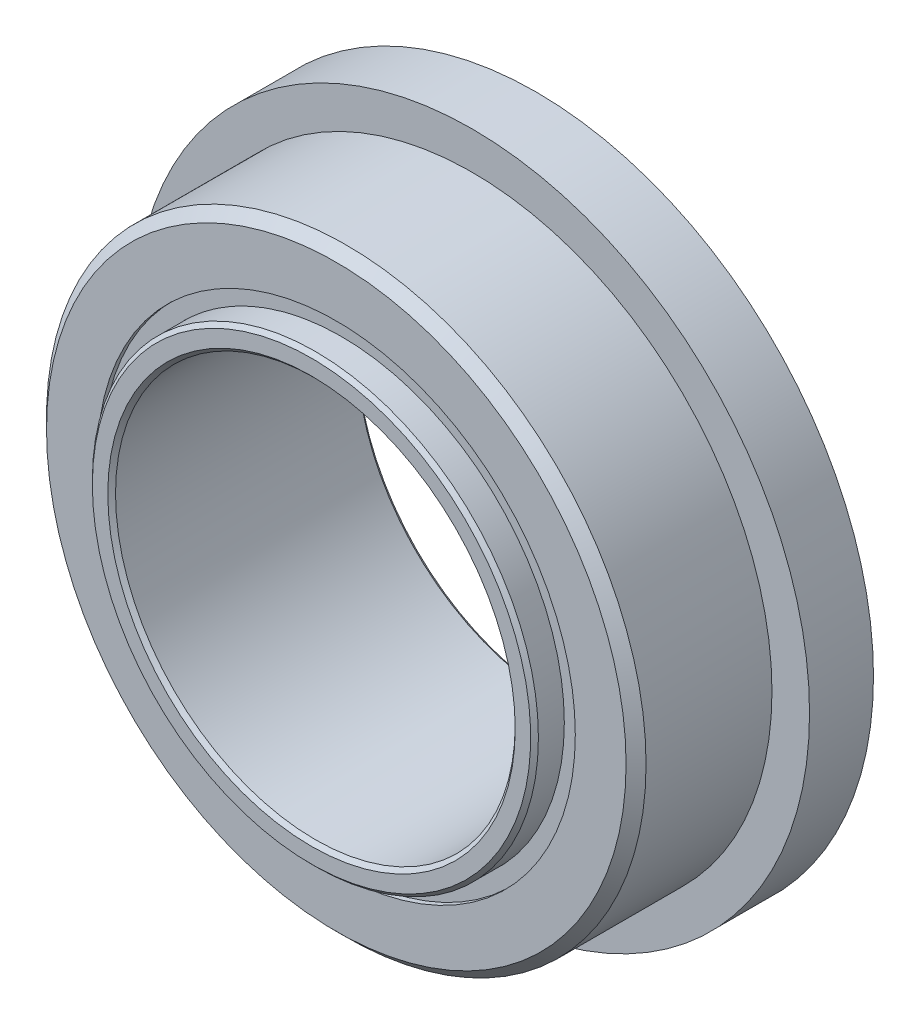
ISO-10303-21;
HEADER;
FILE_DESCRIPTION(('STEP AP214'),'2;1');
FILE_NAME('part.step','',(''),(''),'','','');
FILE_SCHEMA(('AUTOMOTIVE_DESIGN { 1 0 10303 214 1 1 1 1 }'));
ENDSEC;
DATA;
#1=APPLICATION_CONTEXT('core data for automotive mechanical design processes');
#2=APPLICATION_PROTOCOL_DEFINITION('international standard','automotive_design',2000,#1);
#3=PRODUCT_CONTEXT('',#1,'mechanical');
#4=PRODUCT('Part','Part','',(#3));
#5=PRODUCT_RELATED_PRODUCT_CATEGORY('part','',(#4));
#6=PRODUCT_DEFINITION_FORMATION('','',#4);
#7=PRODUCT_DEFINITION_CONTEXT('part definition',#1,'design');
#8=PRODUCT_DEFINITION('design','',#6,#7);
#9=PRODUCT_DEFINITION_SHAPE('','',#8);
#10=(LENGTH_UNIT() NAMED_UNIT(*) SI_UNIT(.MILLI.,.METRE.));
#11=(NAMED_UNIT(*) PLANE_ANGLE_UNIT() SI_UNIT($,.RADIAN.));
#12=(NAMED_UNIT(*) SI_UNIT($,.STERADIAN.) SOLID_ANGLE_UNIT());
#13=UNCERTAINTY_MEASURE_WITH_UNIT(LENGTH_MEASURE(1.E-05),#10,'distance_accuracy_value','');
#14=(GEOMETRIC_REPRESENTATION_CONTEXT(3) GLOBAL_UNCERTAINTY_ASSIGNED_CONTEXT((#13)) GLOBAL_UNIT_ASSIGNED_CONTEXT((#10,
#11,#12)) REPRESENTATION_CONTEXT('',''));
#15=CARTESIAN_POINT('',(0.,0.,0.));
#16=DIRECTION('',(0.,0.,1.));
#17=DIRECTION('',(1.,0.,0.));
#18=AXIS2_PLACEMENT_3D('',#15,#16,#17);
#19=CARTESIAN_POINT('',(0.,3.7973,-1.508125));
#20=DIRECTION('',(0.,0.,1.));
#21=DIRECTION('',(1.,0.,0.));
#22=AXIS2_PLACEMENT_3D('',#19,#20,#21);
#23=PLANE('',#22);
#24=CARTESIAN_POINT('',(0.,0.,-1.508125));
#25=DIRECTION('',(0.,0.,1.));
#26=DIRECTION('',(1.,0.,0.));
#27=AXIS2_PLACEMENT_3D('',#24,#25,#26);
#28=CIRCLE('',#27,3.7973);
#29=CARTESIAN_POINT('',(3.7973,0.,-1.508125));
#30=VERTEX_POINT('',#29);
#31=EDGE_CURVE('E58',#30,#30,#28,.T.);
#32=ORIENTED_EDGE('',*,*,#31,.F.);
#33=EDGE_LOOP('',(#32));
#34=FACE_BOUND('',#33,.T.);
#35=CARTESIAN_POINT('',(0.,0.,-1.508125));
#36=DIRECTION('',(0.,0.,1.));
#37=DIRECTION('',(1.,0.,0.));
#38=AXIS2_PLACEMENT_3D('',#35,#36,#37);
#39=CIRCLE('',#38,3.5433);
#40=CARTESIAN_POINT('',(3.5433,0.,-1.508125));
#41=VERTEX_POINT('',#40);
#42=EDGE_CURVE('E11',#41,#41,#39,.T.);
#43=ORIENTED_EDGE('',*,*,#42,.T.);
#44=EDGE_LOOP('',(#43));
#45=FACE_BOUND('',#44,.T.);
#46=ADVANCED_FACE('F44',(#34,#45),#23,.F.);
#47=CARTESIAN_POINT('',(0.,0.,1.5875));
#48=DIRECTION('',(0.,0.,1.));
#49=DIRECTION('',(1.,0.,0.));
#50=AXIS2_PLACEMENT_3D('',#47,#48,#49);
#51=CYLINDRICAL_SURFACE('',#50,3.5433);
#52=ORIENTED_EDGE('',*,*,#42,.F.);
#53=EDGE_LOOP('',(#52));
#54=FACE_BOUND('',#53,.T.);
#55=CARTESIAN_POINT('',(0.,0.,-0.529166666666667));
#56=DIRECTION('',(0.,0.,1.));
#57=DIRECTION('',(1.,0.,0.));
#58=AXIS2_PLACEMENT_3D('',#55,#56,#57);
#59=CIRCLE('',#58,3.5433);
#60=CARTESIAN_POINT('',(3.5433,0.,-0.529166666666667));
#61=VERTEX_POINT('',#60);
#62=EDGE_CURVE('E50',#61,#61,#59,.T.);
#63=ORIENTED_EDGE('',*,*,#62,.T.);
#64=EDGE_LOOP('',(#63));
#65=FACE_BOUND('',#64,.T.);
#66=ADVANCED_FACE('F67',(#54,#65),#51,.F.);
#67=CARTESIAN_POINT('',(0.,3.7973,-0.529166666666667));
#68=DIRECTION('',(0.,0.,-1.));
#69=DIRECTION('',(-1.,0.,0.));
#70=AXIS2_PLACEMENT_3D('',#67,#68,#69);
#71=PLANE('',#70);
#72=ORIENTED_EDGE('',*,*,#62,.F.);
#73=EDGE_LOOP('',(#72));
#74=FACE_BOUND('',#73,.T.);
#75=CARTESIAN_POINT('',(0.,0.,-0.529166666666667));
#76=DIRECTION('',(0.,0.,1.));
#77=DIRECTION('',(1.,0.,0.));
#78=AXIS2_PLACEMENT_3D('',#75,#76,#77);
#79=CIRCLE('',#78,3.7973);
#80=CARTESIAN_POINT('',(3.7973,0.,-0.529166666666667));
#81=VERTEX_POINT('',#80);
#82=EDGE_CURVE('E54',#81,#81,#79,.T.);
#83=ORIENTED_EDGE('',*,*,#82,.T.);
#84=EDGE_LOOP('',(#83));
#85=FACE_BOUND('',#84,.T.);
#86=ADVANCED_FACE('F71',(#74,#85),#71,.F.);
#87=CARTESIAN_POINT('',(0.,0.,1.5875));
#88=DIRECTION('',(0.,0.,1.));
#89=DIRECTION('',(1.,0.,0.));
#90=AXIS2_PLACEMENT_3D('',#87,#88,#89);
#91=CYLINDRICAL_SURFACE('',#90,3.7973);
#92=ORIENTED_EDGE('',*,*,#82,.F.);
#93=EDGE_LOOP('',(#92));
#94=FACE_BOUND('',#93,.T.);
#95=ORIENTED_EDGE('',*,*,#31,.T.);
#96=EDGE_LOOP('',(#95));
#97=FACE_BOUND('',#96,.T.);
#98=ADVANCED_FACE('F64',(#94,#97),#91,.T.);
#99=CLOSED_SHELL('',(#46,#66,#86,#98));
#100=MANIFOLD_SOLID_BREP('B2',#99);
#101=CARTESIAN_POINT('',(0.,3.7973,1.508125));
#102=DIRECTION('',(0.,0.,-1.));
#103=DIRECTION('',(-1.,0.,0.));
#104=AXIS2_PLACEMENT_3D('',#101,#102,#103);
#105=PLANE('',#104);
#106=CARTESIAN_POINT('',(0.,0.,1.508125));
#107=DIRECTION('',(0.,0.,1.));
#108=DIRECTION('',(1.,0.,0.));
#109=AXIS2_PLACEMENT_3D('',#106,#107,#108);
#110=CIRCLE('',#109,3.5433);
#111=CARTESIAN_POINT('',(3.5433,0.,1.508125));
#112=VERTEX_POINT('',#111);
#113=EDGE_CURVE('E43',#112,#112,#110,.T.);
#114=ORIENTED_EDGE('',*,*,#113,.F.);
#115=EDGE_LOOP('',(#114));
#116=FACE_BOUND('',#115,.T.);
#117=CARTESIAN_POINT('',(0.,0.,1.508125));
#118=DIRECTION('',(0.,0.,1.));
#119=DIRECTION('',(1.,0.,0.));
#120=AXIS2_PLACEMENT_3D('',#117,#118,#119);
#121=CIRCLE('',#120,3.7973);
#122=CARTESIAN_POINT('',(3.7973,0.,1.508125));
#123=VERTEX_POINT('',#122);
#124=EDGE_CURVE('E126',#123,#123,#121,.T.);
#125=ORIENTED_EDGE('',*,*,#124,.T.);
#126=EDGE_LOOP('',(#125));
#127=FACE_BOUND('',#126,.T.);
#128=ADVANCED_FACE('F112',(#116,#127),#105,.F.);
#129=CARTESIAN_POINT('',(0.,0.,1.5875));
#130=DIRECTION('',(0.,0.,1.));
#131=DIRECTION('',(1.,0.,0.));
#132=AXIS2_PLACEMENT_3D('',#129,#130,#131);
#133=CYLINDRICAL_SURFACE('',#132,3.5433);
#134=CARTESIAN_POINT('',(0.,0.,0.529166666666666));
#135=DIRECTION('',(0.,0.,1.));
#136=DIRECTION('',(1.,0.,0.));
#137=AXIS2_PLACEMENT_3D('',#134,#135,#136);
#138=CIRCLE('',#137,3.5433);
#139=CARTESIAN_POINT('',(3.5433,0.,0.529166666666666));
#140=VERTEX_POINT('',#139);
#141=EDGE_CURVE('E118',#140,#140,#138,.T.);
#142=ORIENTED_EDGE('',*,*,#141,.F.);
#143=EDGE_LOOP('',(#142));
#144=FACE_BOUND('',#143,.T.);
#145=ORIENTED_EDGE('',*,*,#113,.T.);
#146=EDGE_LOOP('',(#145));
#147=FACE_BOUND('',#146,.T.);
#148=ADVANCED_FACE('F141',(#144,#147),#133,.F.);
#149=CARTESIAN_POINT('',(0.,3.7973,0.529166666666666));
#150=DIRECTION('',(0.,0.,1.));
#151=DIRECTION('',(1.,0.,0.));
#152=AXIS2_PLACEMENT_3D('',#149,#150,#151);
#153=PLANE('',#152);
#154=CARTESIAN_POINT('',(0.,0.,0.529166666666666));
#155=DIRECTION('',(0.,0.,1.));
#156=DIRECTION('',(1.,0.,0.));
#157=AXIS2_PLACEMENT_3D('',#154,#155,#156);
#158=CIRCLE('',#157,3.7973);
#159=CARTESIAN_POINT('',(3.7973,0.,0.529166666666666));
#160=VERTEX_POINT('',#159);
#161=EDGE_CURVE('E122',#160,#160,#158,.T.);
#162=ORIENTED_EDGE('',*,*,#161,.F.);
#163=EDGE_LOOP('',(#162));
#164=FACE_BOUND('',#163,.T.);
#165=ORIENTED_EDGE('',*,*,#141,.T.);
#166=EDGE_LOOP('',(#165));
#167=FACE_BOUND('',#166,.T.);
#168=ADVANCED_FACE('F136',(#164,#167),#153,.F.);
#169=CARTESIAN_POINT('',(0.,0.,1.5875));
#170=DIRECTION('',(0.,0.,1.));
#171=DIRECTION('',(1.,0.,0.));
#172=AXIS2_PLACEMENT_3D('',#169,#170,#171);
#173=CYLINDRICAL_SURFACE('',#172,3.7973);
#174=ORIENTED_EDGE('',*,*,#124,.F.);
#175=EDGE_LOOP('',(#174));
#176=FACE_BOUND('',#175,.T.);
#177=ORIENTED_EDGE('',*,*,#161,.T.);
#178=EDGE_LOOP('',(#177));
#179=FACE_BOUND('',#178,.T.);
#180=ADVANCED_FACE('F133',(#176,#179),#173,.T.);
#181=CLOSED_SHELL('',(#128,#148,#168,#180));
#182=MANIFOLD_SOLID_BREP('B6',#181);
#183=CARTESIAN_POINT('',(-1.94415833333329,3.36738101129179,0.));
#184=DIRECTION('',(0.,0.,1.));
#185=DIRECTION('',(-0.499999999999989,0.866025403784445,0.));
#186=AXIS2_PLACEMENT_3D('',#183,#184,#185);
#187=SPHERICAL_SURFACE('',#186,0.529166666666667);
#188=CARTESIAN_POINT('',(-1.94415833333329,3.36738101129179,0.529166666666666));
#189=VERTEX_POINT('',#188);
#190=VERTEX_LOOP('',#189);
#191=FACE_BOUND('',#190,.T.);
#192=ADVANCED_FACE('F180',(#191),#187,.T.);
#193=CLOSED_SHELL('',(#192));
#194=MANIFOLD_SOLID_BREP('B38',#193);
#195=CARTESIAN_POINT('',(-3.36738101129174,1.94415833333337,0.));
#196=DIRECTION('',(0.,0.,1.));
#197=DIRECTION('',(-0.866025403784433,0.50000000000001,0.));
#198=AXIS2_PLACEMENT_3D('',#195,#196,#197);
#199=SPHERICAL_SURFACE('',#198,0.529166666666667);
#200=CARTESIAN_POINT('',(-3.36738101129174,1.94415833333337,0.529166666666666));
#201=VERTEX_POINT('',#200);
#202=VERTEX_LOOP('',#201);
#203=FACE_BOUND('',#202,.T.);
#204=ADVANCED_FACE('F201',(#203),#199,.T.);
#205=CLOSED_SHELL('',(#204));
#206=MANIFOLD_SOLID_BREP('B108',#205);
#207=CARTESIAN_POINT('',(-3.88831666666667,0.,0.));
#208=DIRECTION('',(0.,0.,1.));
#209=DIRECTION('',(-1.,0.,0.));
#210=AXIS2_PLACEMENT_3D('',#207,#208,#209);
#211=SPHERICAL_SURFACE('',#210,0.529166666666667);
#212=CARTESIAN_POINT('',(-3.88831666666667,0.,0.529166666666666));
#213=VERTEX_POINT('',#212);
#214=VERTEX_LOOP('',#213);
#215=FACE_BOUND('',#214,.T.);
#216=ADVANCED_FACE('F222',(#215),#211,.T.);
#217=CLOSED_SHELL('',(#216));
#218=MANIFOLD_SOLID_BREP('B176',#217);
#219=CARTESIAN_POINT('',(-3.36738101129178,-1.9441583333333,0.));
#220=DIRECTION('',(0.,0.,1.));
#221=DIRECTION('',(-0.866025403784443,-0.499999999999992,0.));
#222=AXIS2_PLACEMENT_3D('',#219,#220,#221);
#223=SPHERICAL_SURFACE('',#222,0.529166666666667);
#224=CARTESIAN_POINT('',(-3.36738101129178,-1.9441583333333,0.529166666666666));
#225=VERTEX_POINT('',#224);
#226=VERTEX_LOOP('',#225);
#227=FACE_BOUND('',#226,.T.);
#228=ADVANCED_FACE('F243',(#227),#223,.T.);
#229=CLOSED_SHELL('',(#228));
#230=MANIFOLD_SOLID_BREP('B197',#229);
#231=CARTESIAN_POINT('',(-1.94415833333336,-3.36738101129175,0.));
#232=DIRECTION('',(0.,0.,1.));
#233=DIRECTION('',(-0.500000000000007,-0.866025403784435,0.));
#234=AXIS2_PLACEMENT_3D('',#231,#232,#233);
#235=SPHERICAL_SURFACE('',#234,0.529166666666667);
#236=CARTESIAN_POINT('',(-1.94415833333336,-3.36738101129175,0.529166666666666));
#237=VERTEX_POINT('',#236);
#238=VERTEX_LOOP('',#237);
#239=FACE_BOUND('',#238,.T.);
#240=ADVANCED_FACE('F264',(#239),#235,.T.);
#241=CLOSED_SHELL('',(#240));
#242=MANIFOLD_SOLID_BREP('B218',#241);
#243=CARTESIAN_POINT('',(0.,-3.88831666666667,0.));
#244=DIRECTION('',(0.,0.,1.));
#245=DIRECTION('',(0.,-1.,0.));
#246=AXIS2_PLACEMENT_3D('',#243,#244,#245);
#247=SPHERICAL_SURFACE('',#246,0.529166666666667);
#248=CARTESIAN_POINT('',(0.,-3.88831666666667,0.529166666666666));
#249=VERTEX_POINT('',#248);
#250=VERTEX_LOOP('',#249);
#251=FACE_BOUND('',#250,.T.);
#252=ADVANCED_FACE('F285',(#251),#247,.T.);
#253=CLOSED_SHELL('',(#252));
#254=MANIFOLD_SOLID_BREP('B239',#253);
#255=CARTESIAN_POINT('',(1.94415833333331,-3.36738101129177,0.));
#256=DIRECTION('',(0.,0.,1.));
#257=DIRECTION('',(0.499999999999995,-0.866025403784442,0.));
#258=AXIS2_PLACEMENT_3D('',#255,#256,#257);
#259=SPHERICAL_SURFACE('',#258,0.529166666666667);
#260=CARTESIAN_POINT('',(1.94415833333331,-3.36738101129177,0.529166666666666));
#261=VERTEX_POINT('',#260);
#262=VERTEX_LOOP('',#261);
#263=FACE_BOUND('',#262,.T.);
#264=ADVANCED_FACE('F306',(#263),#259,.T.);
#265=CLOSED_SHELL('',(#264));
#266=MANIFOLD_SOLID_BREP('B260',#265);
#267=CARTESIAN_POINT('',(3.36738101129175,-1.94415833333335,0.));
#268=DIRECTION('',(0.,0.,1.));
#269=DIRECTION('',(0.866025403784436,-0.500000000000004,0.));
#270=AXIS2_PLACEMENT_3D('',#267,#268,#269);
#271=SPHERICAL_SURFACE('',#270,0.529166666666667);
#272=CARTESIAN_POINT('',(3.36738101129175,-1.94415833333335,0.529166666666666));
#273=VERTEX_POINT('',#272);
#274=VERTEX_LOOP('',#273);
#275=FACE_BOUND('',#274,.T.);
#276=ADVANCED_FACE('F327',(#275),#271,.T.);
#277=CLOSED_SHELL('',(#276));
#278=MANIFOLD_SOLID_BREP('B281',#277);
#279=CARTESIAN_POINT('',(3.88831666666667,0.,0.));
#280=DIRECTION('',(0.,0.,1.));
#281=DIRECTION('',(1.,0.,0.));
#282=AXIS2_PLACEMENT_3D('',#279,#280,#281);
#283=SPHERICAL_SURFACE('',#282,0.529166666666667);
#284=CARTESIAN_POINT('',(3.88831666666667,0.,0.529166666666666));
#285=VERTEX_POINT('',#284);
#286=VERTEX_LOOP('',#285);
#287=FACE_BOUND('',#286,.T.);
#288=ADVANCED_FACE('F348',(#287),#283,.T.);
#289=CLOSED_SHELL('',(#288));
#290=MANIFOLD_SOLID_BREP('B302',#289);
#291=CARTESIAN_POINT('',(3.36738101129177,1.94415833333333,0.));
#292=DIRECTION('',(0.,0.,1.));
#293=DIRECTION('',(0.86602540378444,0.499999999999998,0.));
#294=AXIS2_PLACEMENT_3D('',#291,#292,#293);
#295=SPHERICAL_SURFACE('',#294,0.529166666666667);
#296=CARTESIAN_POINT('',(3.36738101129177,1.94415833333333,0.529166666666666));
#297=VERTEX_POINT('',#296);
#298=VERTEX_LOOP('',#297);
#299=FACE_BOUND('',#298,.T.);
#300=ADVANCED_FACE('F369',(#299),#295,.T.);
#301=CLOSED_SHELL('',(#300));
#302=MANIFOLD_SOLID_BREP('B323',#301);
#303=CARTESIAN_POINT('',(1.94415833333334,3.36738101129176,0.));
#304=DIRECTION('',(0.,0.,1.));
#305=DIRECTION('',(0.500000000000001,0.866025403784438,0.));
#306=AXIS2_PLACEMENT_3D('',#303,#304,#305);
#307=SPHERICAL_SURFACE('',#306,0.529166666666667);
#308=CARTESIAN_POINT('',(1.94415833333334,3.36738101129176,0.529166666666666));
#309=VERTEX_POINT('',#308);
#310=VERTEX_LOOP('',#309);
#311=FACE_BOUND('',#310,.T.);
#312=ADVANCED_FACE('F390',(#311),#307,.T.);
#313=CLOSED_SHELL('',(#312));
#314=MANIFOLD_SOLID_BREP('B344',#313);
#315=CARTESIAN_POINT('',(0.,3.88831666666667,0.));
#316=DIRECTION('',(0.,0.,1.));
#317=DIRECTION('',(0.,1.,0.));
#318=AXIS2_PLACEMENT_3D('',#315,#316,#317);
#319=SPHERICAL_SURFACE('',#318,0.529166666666667);
#320=CARTESIAN_POINT('',(0.,3.88831666666667,0.529166666666666));
#321=VERTEX_POINT('',#320);
#322=VERTEX_LOOP('',#321);
#323=FACE_BOUND('',#322,.T.);
#324=ADVANCED_FACE('F413',(#323),#319,.T.);
#325=CLOSED_SHELL('',(#324));
#326=MANIFOLD_SOLID_BREP('B365',#325);
#327=CARTESIAN_POINT('',(0.,0.,1.5875));
#328=DIRECTION('',(0.,0.,1.));
#329=DIRECTION('',(1.,0.,0.));
#330=AXIS2_PLACEMENT_3D('',#327,#328,#329);
#331=CYLINDRICAL_SURFACE('',#330,3.5433);
#332=CARTESIAN_POINT('',(0.,0.,1.91981666666666));
#333=DIRECTION('',(0.,0.,-1.));
#334=DIRECTION('',(-1.,0.,0.));
#335=AXIS2_PLACEMENT_3D('',#332,#333,#334);
#336=CIRCLE('',#335,3.5433);
#337=CARTESIAN_POINT('',(-3.5433,0.,1.91981666666666));
#338=VERTEX_POINT('',#337);
#339=EDGE_CURVE('E412',#338,#338,#336,.T.);
#340=ORIENTED_EDGE('',*,*,#339,.T.);
#341=EDGE_LOOP('',(#340));
#342=FACE_BOUND('',#341,.T.);
#343=CARTESIAN_POINT('',(0.,0.,0.401224202701348));
#344=DIRECTION('',(0.,0.,1.));
#345=DIRECTION('',(1.,0.,0.));
#346=AXIS2_PLACEMENT_3D('',#343,#344,#345);
#347=CIRCLE('',#346,3.5433);
#348=CARTESIAN_POINT('',(3.5433,0.,0.401224202701348));
#349=VERTEX_POINT('',#348);
#350=EDGE_CURVE('E468',#349,#349,#347,.T.);
#351=ORIENTED_EDGE('',*,*,#350,.T.);
#352=EDGE_LOOP('',(#351));
#353=FACE_BOUND('',#352,.T.);
#354=ADVANCED_FACE('F433',(#342,#353),#331,.T.);
#355=CARTESIAN_POINT('',(0.,3.5433,1.9812));
#356=DIRECTION('',(0.,0.,-1.));
#357=DIRECTION('',(-1.,0.,0.));
#358=AXIS2_PLACEMENT_3D('',#355,#356,#357);
#359=PLANE('',#358);
#360=CARTESIAN_POINT('',(0.,0.,1.9812));
#361=DIRECTION('',(0.,0.,-1.));
#362=DIRECTION('',(-1.,0.,0.));
#363=AXIS2_PLACEMENT_3D('',#360,#361,#362);
#364=CIRCLE('',#363,3.48191666666667);
#365=CARTESIAN_POINT('',(-3.48191666666667,0.,1.9812));
#366=VERTEX_POINT('',#365);
#367=EDGE_CURVE('E440',#366,#366,#364,.F.);
#368=ORIENTED_EDGE('',*,*,#367,.T.);
#369=EDGE_LOOP('',(#368));
#370=FACE_BOUND('',#369,.T.);
#371=CARTESIAN_POINT('',(0.,0.,1.9812));
#372=DIRECTION('',(0.,0.,-1.));
#373=DIRECTION('',(-1.,0.,0.));
#374=AXIS2_PLACEMENT_3D('',#371,#372,#373);
#375=CIRCLE('',#374,3.23638333333333);
#376=CARTESIAN_POINT('',(-3.23638333333333,0.,1.9812));
#377=VERTEX_POINT('',#376);
#378=EDGE_CURVE('E444',#377,#377,#375,.T.);
#379=ORIENTED_EDGE('',*,*,#378,.T.);
#380=EDGE_LOOP('',(#379));
#381=FACE_BOUND('',#380,.T.);
#382=ADVANCED_FACE('F492',(#370,#381),#359,.F.);
#383=CARTESIAN_POINT('',(0.,0.,1.5875));
#384=DIRECTION('',(0.,0.,1.));
#385=DIRECTION('',(1.,0.,0.));
#386=AXIS2_PLACEMENT_3D('',#383,#384,#385);
#387=CYLINDRICAL_SURFACE('',#386,3.175);
#388=CARTESIAN_POINT('',(0.,0.,-1.91981666666666));
#389=DIRECTION('',(0.,0.,1.));
#390=DIRECTION('',(1.,0.,0.));
#391=AXIS2_PLACEMENT_3D('',#388,#389,#390);
#392=CIRCLE('',#391,3.175);
#393=CARTESIAN_POINT('',(3.175,0.,-1.91981666666666));
#394=VERTEX_POINT('',#393);
#395=EDGE_CURVE('E453',#394,#394,#392,.F.);
#396=ORIENTED_EDGE('',*,*,#395,.T.);
#397=EDGE_LOOP('',(#396));
#398=FACE_BOUND('',#397,.T.);
#399=CARTESIAN_POINT('',(0.,0.,1.91981666666667));
#400=DIRECTION('',(0.,0.,-1.));
#401=DIRECTION('',(-1.,0.,0.));
#402=AXIS2_PLACEMENT_3D('',#399,#400,#401);
#403=CIRCLE('',#402,3.175);
#404=CARTESIAN_POINT('',(-3.175,0.,1.91981666666667));
#405=VERTEX_POINT('',#404);
#406=EDGE_CURVE('E456',#405,#405,#403,.F.);
#407=ORIENTED_EDGE('',*,*,#406,.T.);
#408=EDGE_LOOP('',(#407));
#409=FACE_BOUND('',#408,.T.);
#410=ADVANCED_FACE('F488',(#398,#409),#387,.F.);
#411=CARTESIAN_POINT('',(0.,3.175,-1.9812));
#412=DIRECTION('',(0.,0.,1.));
#413=DIRECTION('',(1.,0.,0.));
#414=AXIS2_PLACEMENT_3D('',#411,#412,#413);
#415=PLANE('',#414);
#416=CARTESIAN_POINT('',(0.,0.,-1.9812));
#417=DIRECTION('',(0.,0.,1.));
#418=DIRECTION('',(1.,0.,0.));
#419=AXIS2_PLACEMENT_3D('',#416,#417,#418);
#420=CIRCLE('',#419,3.23638333333334);
#421=CARTESIAN_POINT('',(3.23638333333334,0.,-1.9812));
#422=VERTEX_POINT('',#421);
#423=EDGE_CURVE('E459',#422,#422,#420,.T.);
#424=ORIENTED_EDGE('',*,*,#423,.T.);
#425=EDGE_LOOP('',(#424));
#426=FACE_BOUND('',#425,.T.);
#427=CARTESIAN_POINT('',(0.,0.,-1.9812));
#428=DIRECTION('',(0.,0.,1.));
#429=DIRECTION('',(1.,0.,0.));
#430=AXIS2_PLACEMENT_3D('',#427,#428,#429);
#431=CIRCLE('',#430,3.48191666666666);
#432=CARTESIAN_POINT('',(3.48191666666666,0.,-1.9812));
#433=VERTEX_POINT('',#432);
#434=EDGE_CURVE('E462',#433,#433,#431,.F.);
#435=ORIENTED_EDGE('',*,*,#434,.T.);
#436=EDGE_LOOP('',(#435));
#437=FACE_BOUND('',#436,.T.);
#438=ADVANCED_FACE('F482',(#426,#437),#415,.F.);
#439=CARTESIAN_POINT('',(0.,0.,1.5875));
#440=DIRECTION('',(0.,0.,1.));
#441=DIRECTION('',(1.,0.,0.));
#442=AXIS2_PLACEMENT_3D('',#439,#440,#441);
#443=CYLINDRICAL_SURFACE('',#442,3.5433);
#444=CARTESIAN_POINT('',(0.,0.,-1.91981666666666));
#445=DIRECTION('',(0.,0.,1.));
#446=DIRECTION('',(1.,0.,0.));
#447=AXIS2_PLACEMENT_3D('',#444,#445,#446);
#448=CIRCLE('',#447,3.5433);
#449=CARTESIAN_POINT('',(3.5433,0.,-1.91981666666666));
#450=VERTEX_POINT('',#449);
#451=EDGE_CURVE('E448',#450,#450,#448,.T.);
#452=ORIENTED_EDGE('',*,*,#451,.T.);
#453=EDGE_LOOP('',(#452));
#454=FACE_BOUND('',#453,.T.);
#455=CARTESIAN_POINT('',(0.,0.,-0.401224202701349));
#456=DIRECTION('',(0.,0.,1.));
#457=DIRECTION('',(1.,0.,0.));
#458=AXIS2_PLACEMENT_3D('',#455,#456,#457);
#459=CIRCLE('',#458,3.5433);
#460=CARTESIAN_POINT('',(3.5433,0.,-0.401224202701349));
#461=VERTEX_POINT('',#460);
#462=EDGE_CURVE('E465',#461,#461,#459,.T.);
#463=ORIENTED_EDGE('',*,*,#462,.F.);
#464=EDGE_LOOP('',(#463));
#465=FACE_BOUND('',#464,.T.);
#466=ADVANCED_FACE('F477',(#454,#465),#443,.T.);
#467=CARTESIAN_POINT('',(0.,0.,0.));
#468=DIRECTION('',(0.,0.,1.));
#469=DIRECTION('',(1.,0.,0.));
#470=AXIS2_PLACEMENT_3D('',#467,#468,#469);
#471=TOROIDAL_SURFACE('',#470,3.88831666666667,0.529166666666667);
#472=ORIENTED_EDGE('',*,*,#350,.F.);
#473=EDGE_LOOP('',(#472));
#474=FACE_BOUND('',#473,.T.);
#475=ORIENTED_EDGE('',*,*,#462,.T.);
#476=EDGE_LOOP('',(#475));
#477=FACE_BOUND('',#476,.T.);
#478=ADVANCED_FACE('F473',(#474,#477),#471,.F.);
#479=CARTESIAN_POINT('',(0.,0.,-1.9812));
#480=DIRECTION('',(0.,0.,-1.));
#481=DIRECTION('',(-1.,0.,0.));
#482=AXIS2_PLACEMENT_3D('',#479,#480,#481);
#483=CONICAL_SURFACE('',#482,3.23638333333334,0.785398163397448);
#484=ORIENTED_EDGE('',*,*,#395,.F.);
#485=EDGE_LOOP('',(#484));
#486=FACE_BOUND('',#485,.T.);
#487=ORIENTED_EDGE('',*,*,#423,.F.);
#488=EDGE_LOOP('',(#487));
#489=FACE_BOUND('',#488,.T.);
#490=ADVANCED_FACE('F476',(#486,#489),#483,.F.);
#491=CARTESIAN_POINT('',(0.,0.,-1.91981666666666));
#492=DIRECTION('',(0.,0.,1.));
#493=DIRECTION('',(1.,0.,0.));
#494=AXIS2_PLACEMENT_3D('',#491,#492,#493);
#495=CONICAL_SURFACE('',#494,3.5433,0.785398163397448);
#496=ORIENTED_EDGE('',*,*,#434,.F.);
#497=EDGE_LOOP('',(#496));
#498=FACE_BOUND('',#497,.T.);
#499=ORIENTED_EDGE('',*,*,#451,.F.);
#500=EDGE_LOOP('',(#499));
#501=FACE_BOUND('',#500,.T.);
#502=ADVANCED_FACE('F502',(#498,#501),#495,.T.);
#503=CARTESIAN_POINT('',(0.,0.,1.9812));
#504=DIRECTION('',(0.,0.,-1.));
#505=DIRECTION('',(-1.,0.,0.));
#506=AXIS2_PLACEMENT_3D('',#503,#504,#505);
#507=CONICAL_SURFACE('',#506,3.48191666666667,0.785398163397448);
#508=ORIENTED_EDGE('',*,*,#339,.F.);
#509=EDGE_LOOP('',(#508));
#510=FACE_BOUND('',#509,.T.);
#511=ORIENTED_EDGE('',*,*,#367,.F.);
#512=EDGE_LOOP('',(#511));
#513=FACE_BOUND('',#512,.T.);
#514=ADVANCED_FACE('F505',(#510,#513),#507,.T.);
#515=CARTESIAN_POINT('',(0.,0.,1.91981666666667));
#516=DIRECTION('',(0.,0.,1.));
#517=DIRECTION('',(1.,0.,0.));
#518=AXIS2_PLACEMENT_3D('',#515,#516,#517);
#519=CONICAL_SURFACE('',#518,3.175,0.785398163397438);
#520=ORIENTED_EDGE('',*,*,#378,.F.);
#521=EDGE_LOOP('',(#520));
#522=FACE_BOUND('',#521,.T.);
#523=ORIENTED_EDGE('',*,*,#406,.F.);
#524=EDGE_LOOP('',(#523));
#525=FACE_BOUND('',#524,.T.);
#526=ADVANCED_FACE('F435',(#522,#525),#519,.F.);
#527=CLOSED_SHELL('',(#354,#382,#410,#438,#466,#478,#490,#502,#514,#526));
#528=MANIFOLD_SOLID_BREP('B386',#527);
#529=CARTESIAN_POINT('',(0.,0.,1.42875));
#530=DIRECTION('',(0.,0.,-1.));
#531=DIRECTION('',(-1.,0.,0.));
#532=AXIS2_PLACEMENT_3D('',#529,#530,#531);
#533=CONICAL_SURFACE('',#532,4.7625,0.785398163397448);
#534=CARTESIAN_POINT('',(0.,0.,1.5875));
#535=DIRECTION('',(0.,0.,1.));
#536=DIRECTION('',(1.,0.,0.));
#537=AXIS2_PLACEMENT_3D('',#534,#535,#536);
#538=CIRCLE('',#537,4.60375);
#539=CARTESIAN_POINT('',(4.60375,0.,1.5875));
#540=VERTEX_POINT('',#539);
#541=EDGE_CURVE('E607',#540,#540,#538,.T.);
#542=ORIENTED_EDGE('',*,*,#541,.F.);
#543=EDGE_LOOP('',(#542));
#544=FACE_BOUND('',#543,.T.);
#545=CARTESIAN_POINT('',(0.,0.,1.42875));
#546=DIRECTION('',(0.,0.,1.));
#547=DIRECTION('',(1.,0.,0.));
#548=AXIS2_PLACEMENT_3D('',#545,#546,#547);
#549=CIRCLE('',#548,4.7625);
#550=CARTESIAN_POINT('',(4.7625,0.,1.42875));
#551=VERTEX_POINT('',#550);
#552=EDGE_CURVE('E432',#551,#551,#549,.T.);
#553=ORIENTED_EDGE('',*,*,#552,.T.);
#554=EDGE_LOOP('',(#553));
#555=FACE_BOUND('',#554,.T.);
#556=ADVANCED_FACE('F585',(#544,#555),#533,.T.);
#557=CARTESIAN_POINT('',(0.,0.,1.5875));
#558=DIRECTION('',(0.,0.,1.));
#559=DIRECTION('',(1.,0.,0.));
#560=AXIS2_PLACEMENT_3D('',#557,#558,#559);
#561=CYLINDRICAL_SURFACE('',#560,4.7625);
#562=CARTESIAN_POINT('',(0.,0.,-0.5715));
#563=DIRECTION('',(0.,0.,1.));
#564=DIRECTION('',(1.,0.,0.));
#565=AXIS2_PLACEMENT_3D('',#562,#563,#564);
#566=CIRCLE('',#565,4.7625);
#567=CARTESIAN_POINT('',(4.7625,0.,-0.5715));
#568=VERTEX_POINT('',#567);
#569=EDGE_CURVE('E610',#568,#568,#566,.T.);
#570=ORIENTED_EDGE('',*,*,#569,.T.);
#571=EDGE_LOOP('',(#570));
#572=FACE_BOUND('',#571,.T.);
#573=ORIENTED_EDGE('',*,*,#552,.F.);
#574=EDGE_LOOP('',(#573));
#575=FACE_BOUND('',#574,.T.);
#576=ADVANCED_FACE('F630',(#572,#575),#561,.T.);
#577=CARTESIAN_POINT('',(0.,4.60375,-1.5875));
#578=DIRECTION('',(0.,0.,1.));
#579=DIRECTION('',(1.,0.,0.));
#580=AXIS2_PLACEMENT_3D('',#577,#578,#579);
#581=PLANE('',#580);
#582=CARTESIAN_POINT('',(0.,0.,-1.5875));
#583=DIRECTION('',(0.,0.,1.));
#584=DIRECTION('',(1.,0.,0.));
#585=AXIS2_PLACEMENT_3D('',#582,#583,#584);
#586=CIRCLE('',#585,3.7973);
#587=CARTESIAN_POINT('',(3.7973,0.,-1.5875));
#588=VERTEX_POINT('',#587);
#589=EDGE_CURVE('E591',#588,#588,#586,.T.);
#590=ORIENTED_EDGE('',*,*,#589,.T.);
#591=EDGE_LOOP('',(#590));
#592=FACE_BOUND('',#591,.T.);
#593=CARTESIAN_POINT('',(0.,0.,-1.5875));
#594=DIRECTION('',(0.,0.,-1.));
#595=DIRECTION('',(-1.,0.,0.));
#596=AXIS2_PLACEMENT_3D('',#593,#594,#595);
#597=CIRCLE('',#596,5.3594);
#598=CARTESIAN_POINT('',(-5.3594,0.,-1.5875));
#599=VERTEX_POINT('',#598);
#600=EDGE_CURVE('E613',#599,#599,#597,.T.);
#601=ORIENTED_EDGE('',*,*,#600,.T.);
#602=EDGE_LOOP('',(#601));
#603=FACE_BOUND('',#602,.T.);
#604=ADVANCED_FACE('F633',(#592,#603),#581,.F.);
#605=CARTESIAN_POINT('',(0.,0.,1.5875));
#606=DIRECTION('',(0.,0.,1.));
#607=DIRECTION('',(1.,0.,0.));
#608=AXIS2_PLACEMENT_3D('',#605,#606,#607);
#609=CYLINDRICAL_SURFACE('',#608,3.7973);
#610=CARTESIAN_POINT('',(0.,0.,-0.52128046913346));
#611=DIRECTION('',(0.,0.,1.));
#612=DIRECTION('',(1.,0.,0.));
#613=AXIS2_PLACEMENT_3D('',#610,#611,#612);
#614=CIRCLE('',#613,3.7973);
#615=CARTESIAN_POINT('',(3.7973,0.,-0.52128046913346));
#616=VERTEX_POINT('',#615);
#617=EDGE_CURVE('E595',#616,#616,#614,.T.);
#618=ORIENTED_EDGE('',*,*,#617,.T.);
#619=EDGE_LOOP('',(#618));
#620=FACE_BOUND('',#619,.T.);
#621=ORIENTED_EDGE('',*,*,#589,.F.);
#622=EDGE_LOOP('',(#621));
#623=FACE_BOUND('',#622,.T.);
#624=ADVANCED_FACE('F638',(#620,#623),#609,.F.);
#625=CARTESIAN_POINT('',(0.,0.,0.));
#626=DIRECTION('',(0.,0.,1.));
#627=DIRECTION('',(1.,0.,0.));
#628=AXIS2_PLACEMENT_3D('',#625,#626,#627);
#629=TOROIDAL_SURFACE('',#628,3.88831666666667,0.529166666666666);
#630=ORIENTED_EDGE('',*,*,#617,.F.);
#631=EDGE_LOOP('',(#630));
#632=FACE_BOUND('',#631,.T.);
#633=CARTESIAN_POINT('',(0.,0.,0.521280469133459));
#634=DIRECTION('',(0.,0.,1.));
#635=DIRECTION('',(1.,0.,0.));
#636=AXIS2_PLACEMENT_3D('',#633,#634,#635);
#637=CIRCLE('',#636,3.7973);
#638=CARTESIAN_POINT('',(3.7973,0.,0.521280469133459));
#639=VERTEX_POINT('',#638);
#640=EDGE_CURVE('E599',#639,#639,#637,.T.);
#641=ORIENTED_EDGE('',*,*,#640,.T.);
#642=EDGE_LOOP('',(#641));
#643=FACE_BOUND('',#642,.T.);
#644=ADVANCED_FACE('F644',(#632,#643),#629,.F.);
#645=CARTESIAN_POINT('',(0.,0.,1.5875));
#646=DIRECTION('',(0.,0.,1.));
#647=DIRECTION('',(1.,0.,0.));
#648=AXIS2_PLACEMENT_3D('',#645,#646,#647);
#649=CYLINDRICAL_SURFACE('',#648,3.7973);
#650=ORIENTED_EDGE('',*,*,#640,.F.);
#651=EDGE_LOOP('',(#650));
#652=FACE_BOUND('',#651,.T.);
#653=CARTESIAN_POINT('',(0.,0.,1.5875));
#654=DIRECTION('',(0.,0.,1.));
#655=DIRECTION('',(1.,0.,0.));
#656=AXIS2_PLACEMENT_3D('',#653,#654,#655);
#657=CIRCLE('',#656,3.7973);
#658=CARTESIAN_POINT('',(3.7973,0.,1.5875));
#659=VERTEX_POINT('',#658);
#660=EDGE_CURVE('E604',#659,#659,#657,.T.);
#661=ORIENTED_EDGE('',*,*,#660,.T.);
#662=EDGE_LOOP('',(#661));
#663=FACE_BOUND('',#662,.T.);
#664=ADVANCED_FACE('F648',(#652,#663),#649,.F.);
#665=CARTESIAN_POINT('',(0.,4.60375,1.5875));
#666=DIRECTION('',(0.,0.,-1.));
#667=DIRECTION('',(-1.,0.,0.));
#668=AXIS2_PLACEMENT_3D('',#665,#666,#667);
#669=PLANE('',#668);
#670=ORIENTED_EDGE('',*,*,#660,.F.);
#671=EDGE_LOOP('',(#670));
#672=FACE_BOUND('',#671,.T.);
#673=ORIENTED_EDGE('',*,*,#541,.T.);
#674=EDGE_LOOP('',(#673));
#675=FACE_BOUND('',#674,.T.);
#676=ADVANCED_FACE('F626',(#672,#675),#669,.F.);
#677=CARTESIAN_POINT('',(0.,3.7973,-0.5715));
#678=DIRECTION('',(0.,0.,1.));
#679=DIRECTION('',(1.,0.,0.));
#680=AXIS2_PLACEMENT_3D('',#677,#678,#679);
#681=PLANE('',#680);
#682=CARTESIAN_POINT('',(0.,0.,-0.5715));
#683=DIRECTION('',(0.,0.,-1.));
#684=DIRECTION('',(-1.,0.,0.));
#685=AXIS2_PLACEMENT_3D('',#682,#683,#684);
#686=CIRCLE('',#685,5.3594);
#687=CARTESIAN_POINT('',(-5.3594,0.,-0.5715));
#688=VERTEX_POINT('',#687);
#689=EDGE_CURVE('E616',#688,#688,#686,.T.);
#690=ORIENTED_EDGE('',*,*,#689,.F.);
#691=EDGE_LOOP('',(#690));
#692=FACE_BOUND('',#691,.T.);
#693=ORIENTED_EDGE('',*,*,#569,.F.);
#694=EDGE_LOOP('',(#693));
#695=FACE_BOUND('',#694,.T.);
#696=ADVANCED_FACE('F623',(#692,#695),#681,.T.);
#697=CARTESIAN_POINT('',(0.,0.,-1.5875));
#698=DIRECTION('',(0.,0.,-1.));
#699=DIRECTION('',(-1.,0.,0.));
#700=AXIS2_PLACEMENT_3D('',#697,#698,#699);
#701=CYLINDRICAL_SURFACE('',#700,5.3594);
#702=ORIENTED_EDGE('',*,*,#689,.T.);
#703=EDGE_LOOP('',(#702));
#704=FACE_BOUND('',#703,.T.);
#705=ORIENTED_EDGE('',*,*,#600,.F.);
#706=EDGE_LOOP('',(#705));
#707=FACE_BOUND('',#706,.T.);
#708=ADVANCED_FACE('F620',(#704,#707),#701,.T.);
#709=CLOSED_SHELL('',(#556,#576,#604,#624,#644,#664,#676,#696,#708));
#710=MANIFOLD_SOLID_BREP('B407',#709);
#711=ADVANCED_BREP_SHAPE_REPRESENTATION('',(#18,#100,#182,#194,#206,#218,#230,#242,#254,#266,
#278,#290,#302,#314,#326,#528,#710),#14);
#712=SHAPE_DEFINITION_REPRESENTATION(#9,#711);
ENDSEC;
END-ISO-10303-21;
